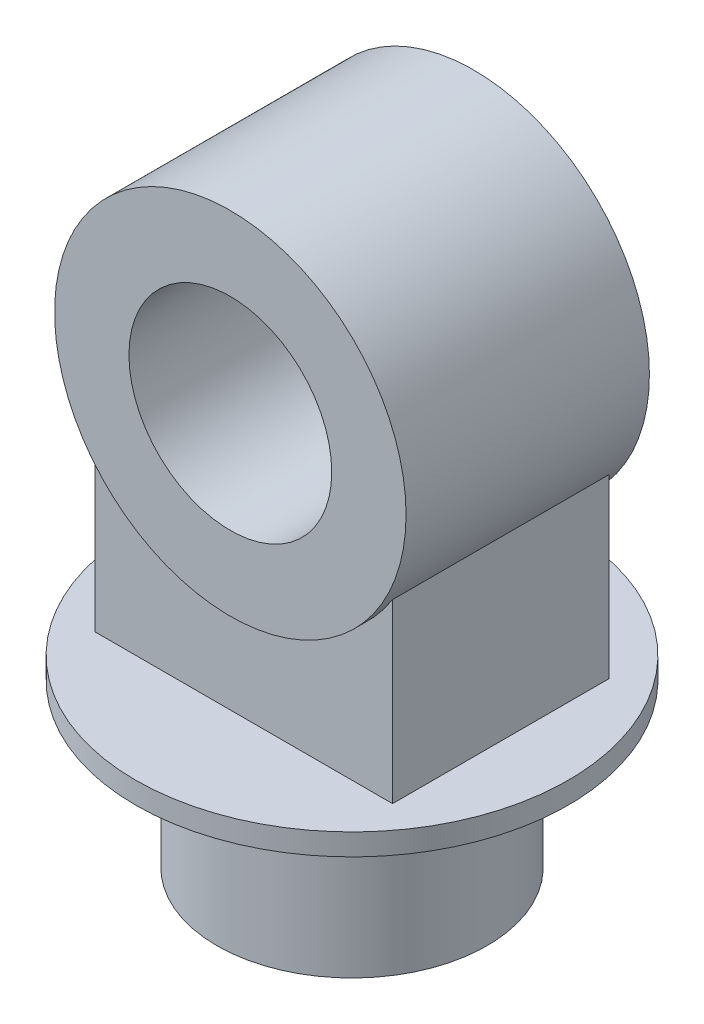
ISO-10303-21;
HEADER;
FILE_DESCRIPTION(('STEP AP214'),'2;1');
FILE_NAME('part.step','',(''),(''),'','','');
FILE_SCHEMA(('AUTOMOTIVE_DESIGN { 1 0 10303 214 1 1 1 1 }'));
ENDSEC;
DATA;
#1=APPLICATION_CONTEXT('core data for automotive mechanical design processes');
#2=APPLICATION_PROTOCOL_DEFINITION('international standard','automotive_design',2000,#1);
#3=PRODUCT_CONTEXT('',#1,'mechanical');
#4=PRODUCT('Part','Part','',(#3));
#5=PRODUCT_RELATED_PRODUCT_CATEGORY('part','',(#4));
#6=PRODUCT_DEFINITION_FORMATION('','',#4);
#7=PRODUCT_DEFINITION_CONTEXT('part definition',#1,'design');
#8=PRODUCT_DEFINITION('design','',#6,#7);
#9=PRODUCT_DEFINITION_SHAPE('','',#8);
#10=(LENGTH_UNIT() NAMED_UNIT(*) SI_UNIT(.MILLI.,.METRE.));
#11=(NAMED_UNIT(*) PLANE_ANGLE_UNIT() SI_UNIT($,.RADIAN.));
#12=(NAMED_UNIT(*) SI_UNIT($,.STERADIAN.) SOLID_ANGLE_UNIT());
#13=UNCERTAINTY_MEASURE_WITH_UNIT(LENGTH_MEASURE(1.E-05),#10,'distance_accuracy_value','');
#14=(GEOMETRIC_REPRESENTATION_CONTEXT(3) GLOBAL_UNCERTAINTY_ASSIGNED_CONTEXT((#13)) GLOBAL_UNIT_ASSIGNED_CONTEXT((#10,
#11,#12)) REPRESENTATION_CONTEXT('',''));
#15=CARTESIAN_POINT('',(0.,0.,0.));
#16=DIRECTION('',(0.,0.,1.));
#17=DIRECTION('',(1.,0.,0.));
#18=AXIS2_PLACEMENT_3D('',#15,#16,#17);
#19=CARTESIAN_POINT('',(0.,120.,0.));
#20=DIRECTION('',(0.,-1.,0.));
#21=DIRECTION('',(0.,0.,-1.));
#22=AXIS2_PLACEMENT_3D('',#19,#20,#21);
#23=CYLINDRICAL_SURFACE('',#22,100.);
#24=CARTESIAN_POINT('',(0.,120.,0.));
#25=DIRECTION('',(0.,1.,0.));
#26=DIRECTION('',(0.,0.,1.));
#27=AXIS2_PLACEMENT_3D('',#24,#25,#26);
#28=CIRCLE('',#27,100.);
#29=CARTESIAN_POINT('',(0.,120.,100.));
#30=VERTEX_POINT('',#29);
#31=EDGE_CURVE('E11',#30,#30,#28,.T.);
#32=ORIENTED_EDGE('',*,*,#31,.F.);
#33=EDGE_LOOP('',(#32));
#34=FACE_BOUND('',#33,.T.);
#35=CARTESIAN_POINT('',(0.,0.,0.));
#36=DIRECTION('',(0.,1.,0.));
#37=DIRECTION('',(0.,0.,1.));
#38=AXIS2_PLACEMENT_3D('',#35,#36,#37);
#39=CIRCLE('',#38,100.);
#40=CARTESIAN_POINT('',(0.,0.,100.));
#41=VERTEX_POINT('',#40);
#42=EDGE_CURVE('E42',#41,#41,#39,.T.);
#43=ORIENTED_EDGE('',*,*,#42,.T.);
#44=EDGE_LOOP('',(#43));
#45=FACE_BOUND('',#44,.T.);
#46=ADVANCED_FACE('F39',(#34,#45),#23,.T.);
#47=CARTESIAN_POINT('',(0.,0.,0.));
#48=DIRECTION('',(0.,1.,0.));
#49=DIRECTION('',(0.,0.,1.));
#50=AXIS2_PLACEMENT_3D('',#47,#48,#49);
#51=PLANE('',#50);
#52=ORIENTED_EDGE('',*,*,#42,.F.);
#53=EDGE_LOOP('',(#52));
#54=FACE_BOUND('',#53,.T.);
#55=ADVANCED_FACE('F115',(#54),#51,.F.);
#56=CARTESIAN_POINT('',(0.,136.,0.));
#57=DIRECTION('',(0.,-1.,0.));
#58=DIRECTION('',(0.,0.,-1.));
#59=AXIS2_PLACEMENT_3D('',#56,#57,#58);
#60=CYLINDRICAL_SURFACE('',#59,160.);
#61=CARTESIAN_POINT('',(0.,136.,0.));
#62=DIRECTION('',(0.,1.,0.));
#63=DIRECTION('',(0.,0.,1.));
#64=AXIS2_PLACEMENT_3D('',#61,#62,#63);
#65=CIRCLE('',#64,160.);
#66=CARTESIAN_POINT('',(0.,136.,160.));
#67=VERTEX_POINT('',#66);
#68=EDGE_CURVE('E102',#67,#67,#65,.T.);
#69=ORIENTED_EDGE('',*,*,#68,.F.);
#70=EDGE_LOOP('',(#69));
#71=FACE_BOUND('',#70,.T.);
#72=CARTESIAN_POINT('',(0.,120.,0.));
#73=DIRECTION('',(0.,1.,0.));
#74=DIRECTION('',(0.,0.,1.));
#75=AXIS2_PLACEMENT_3D('',#72,#73,#74);
#76=CIRCLE('',#75,160.);
#77=CARTESIAN_POINT('',(0.,120.,160.));
#78=VERTEX_POINT('',#77);
#79=EDGE_CURVE('E99',#78,#78,#76,.T.);
#80=ORIENTED_EDGE('',*,*,#79,.T.);
#81=EDGE_LOOP('',(#80));
#82=FACE_BOUND('',#81,.T.);
#83=ADVANCED_FACE('F117',(#71,#82),#60,.T.);
#84=CARTESIAN_POINT('',(0.,136.,0.));
#85=DIRECTION('',(0.,1.,0.));
#86=DIRECTION('',(0.,0.,1.));
#87=AXIS2_PLACEMENT_3D('',#84,#85,#86);
#88=PLANE('',#87);
#89=DIRECTION('',(0.,0.,1.));
#90=VECTOR('',#89,1.);
#91=CARTESIAN_POINT('',(-110.,136.,80.));
#92=LINE('',#91,#90);
#93=CARTESIAN_POINT('',(-110.,136.,-80.));
#94=VERTEX_POINT('',#93);
#95=CARTESIAN_POINT('',(-110.,136.,80.));
#96=VERTEX_POINT('',#95);
#97=EDGE_CURVE('E53',#94,#96,#92,.T.);
#98=ORIENTED_EDGE('',*,*,#97,.F.);
#99=DIRECTION('',(-1.,0.,0.));
#100=VECTOR('',#99,1.);
#101=CARTESIAN_POINT('',(110.,136.,-80.));
#102=LINE('',#101,#100);
#103=CARTESIAN_POINT('',(110.,136.,-80.));
#104=VERTEX_POINT('',#103);
#105=EDGE_CURVE('E58',#104,#94,#102,.T.);
#106=ORIENTED_EDGE('',*,*,#105,.F.);
#107=DIRECTION('',(0.,0.,-1.));
#108=VECTOR('',#107,1.);
#109=CARTESIAN_POINT('',(110.,136.,80.));
#110=LINE('',#109,#108);
#111=CARTESIAN_POINT('',(110.,136.,80.));
#112=VERTEX_POINT('',#111);
#113=EDGE_CURVE('E179',#112,#104,#110,.T.);
#114=ORIENTED_EDGE('',*,*,#113,.F.);
#115=DIRECTION('',(1.,0.,0.));
#116=VECTOR('',#115,1.);
#117=CARTESIAN_POINT('',(110.,136.,80.));
#118=LINE('',#117,#116);
#119=EDGE_CURVE('E84',#96,#112,#118,.T.);
#120=ORIENTED_EDGE('',*,*,#119,.F.);
#121=EDGE_LOOP('',(#98,#106,#114,#120));
#122=FACE_BOUND('',#121,.T.);
#123=ORIENTED_EDGE('',*,*,#68,.T.);
#124=EDGE_LOOP('',(#123));
#125=FACE_BOUND('',#124,.T.);
#126=ADVANCED_FACE('F122',(#122,#125),#88,.T.);
#127=CARTESIAN_POINT('',(0.,120.,0.));
#128=DIRECTION('',(0.,1.,0.));
#129=DIRECTION('',(0.,0.,1.));
#130=AXIS2_PLACEMENT_3D('',#127,#128,#129);
#131=PLANE('',#130);
#132=ORIENTED_EDGE('',*,*,#31,.T.);
#133=EDGE_LOOP('',(#132));
#134=FACE_BOUND('',#133,.T.);
#135=ORIENTED_EDGE('',*,*,#79,.F.);
#136=EDGE_LOOP('',(#135));
#137=FACE_BOUND('',#136,.T.);
#138=ADVANCED_FACE('F127',(#134,#137),#131,.F.);
#139=CARTESIAN_POINT('',(110.,466.002,80.));
#140=DIRECTION('',(0.,0.,-1.));
#141=DIRECTION('',(-1.,0.,0.));
#142=AXIS2_PLACEMENT_3D('',#139,#140,#141);
#143=PLANE('',#142);
#144=CARTESIAN_POINT('',(0.,336.,80.));
#145=DIRECTION('',(0.,0.,-1.));
#146=DIRECTION('',(-1.,0.,0.));
#147=AXIS2_PLACEMENT_3D('',#144,#145,#146);
#148=CIRCLE('',#147,130.);
#149=CARTESIAN_POINT('',(-110.,266.717967697245,80.));
#150=VERTEX_POINT('',#149);
#151=CARTESIAN_POINT('',(110.,266.717967697245,80.));
#152=VERTEX_POINT('',#151);
#153=EDGE_CURVE('E94',#150,#152,#148,.F.);
#154=ORIENTED_EDGE('',*,*,#153,.F.);
#155=DIRECTION('',(0.,-1.,0.));
#156=VECTOR('',#155,1.);
#157=CARTESIAN_POINT('',(-110.,466.002,80.));
#158=LINE('',#157,#156);
#159=EDGE_CURVE('E91',#150,#96,#158,.T.);
#160=ORIENTED_EDGE('',*,*,#159,.T.);
#161=ORIENTED_EDGE('',*,*,#119,.T.);
#162=DIRECTION('',(0.,-1.,0.));
#163=VECTOR('',#162,1.);
#164=CARTESIAN_POINT('',(110.,466.002,80.));
#165=LINE('',#164,#163);
#166=EDGE_CURVE('E186',#152,#112,#165,.T.);
#167=ORIENTED_EDGE('',*,*,#166,.F.);
#168=EDGE_LOOP('',(#154,#160,#161,#167));
#169=FACE_BOUND('',#168,.T.);
#170=ADVANCED_FACE('F130',(#169),#143,.F.);
#171=CARTESIAN_POINT('',(-110.,466.002,80.));
#172=DIRECTION('',(1.,0.,0.));
#173=DIRECTION('',(0.,0.,-1.));
#174=AXIS2_PLACEMENT_3D('',#171,#172,#173);
#175=PLANE('',#174);
#176=DIRECTION('',(0.,0.,-1.));
#177=VECTOR('',#176,1.);
#178=CARTESIAN_POINT('',(-110.,266.717967697245,90.));
#179=LINE('',#178,#177);
#180=CARTESIAN_POINT('',(-110.,266.717967697245,-80.));
#181=VERTEX_POINT('',#180);
#182=EDGE_CURVE('E88',#181,#150,#179,.F.);
#183=ORIENTED_EDGE('',*,*,#182,.F.);
#184=DIRECTION('',(0.,-1.,0.));
#185=VECTOR('',#184,1.);
#186=CARTESIAN_POINT('',(-110.,466.002,-80.));
#187=LINE('',#186,#185);
#188=EDGE_CURVE('E76',#181,#94,#187,.T.);
#189=ORIENTED_EDGE('',*,*,#188,.T.);
#190=ORIENTED_EDGE('',*,*,#97,.T.);
#191=ORIENTED_EDGE('',*,*,#159,.F.);
#192=EDGE_LOOP('',(#183,#189,#190,#191));
#193=FACE_BOUND('',#192,.T.);
#194=ADVANCED_FACE('F89',(#193),#175,.F.);
#195=CARTESIAN_POINT('',(110.,466.002,80.));
#196=DIRECTION('',(-1.,0.,0.));
#197=DIRECTION('',(0.,0.,1.));
#198=AXIS2_PLACEMENT_3D('',#195,#196,#197);
#199=PLANE('',#198);
#200=DIRECTION('',(0.,0.,-1.));
#201=VECTOR('',#200,1.);
#202=CARTESIAN_POINT('',(110.,266.717967697245,90.));
#203=LINE('',#202,#201);
#204=CARTESIAN_POINT('',(110.,266.717967697245,-80.));
#205=VERTEX_POINT('',#204);
#206=EDGE_CURVE('E98',#152,#205,#203,.T.);
#207=ORIENTED_EDGE('',*,*,#206,.F.);
#208=ORIENTED_EDGE('',*,*,#166,.T.);
#209=ORIENTED_EDGE('',*,*,#113,.T.);
#210=DIRECTION('',(0.,-1.,0.));
#211=VECTOR('',#210,1.);
#212=CARTESIAN_POINT('',(110.,466.002,-80.));
#213=LINE('',#212,#211);
#214=EDGE_CURVE('E83',#205,#104,#213,.T.);
#215=ORIENTED_EDGE('',*,*,#214,.F.);
#216=EDGE_LOOP('',(#207,#208,#209,#215));
#217=FACE_BOUND('',#216,.T.);
#218=ADVANCED_FACE('F136',(#217),#199,.F.);
#219=CARTESIAN_POINT('',(110.,466.002,-80.));
#220=DIRECTION('',(0.,0.,1.));
#221=DIRECTION('',(1.,0.,0.));
#222=AXIS2_PLACEMENT_3D('',#219,#220,#221);
#223=PLANE('',#222);
#224=CARTESIAN_POINT('',(0.,336.,-80.));
#225=DIRECTION('',(0.,0.,1.));
#226=DIRECTION('',(1.,0.,0.));
#227=AXIS2_PLACEMENT_3D('',#224,#225,#226);
#228=CIRCLE('',#227,130.);
#229=EDGE_CURVE('E80',#205,#181,#228,.F.);
#230=ORIENTED_EDGE('',*,*,#229,.F.);
#231=ORIENTED_EDGE('',*,*,#214,.T.);
#232=ORIENTED_EDGE('',*,*,#105,.T.);
#233=ORIENTED_EDGE('',*,*,#188,.F.);
#234=EDGE_LOOP('',(#230,#231,#232,#233));
#235=FACE_BOUND('',#234,.T.);
#236=ADVANCED_FACE('F78',(#235),#223,.F.);
#237=CARTESIAN_POINT('',(0.,336.,90.));
#238=DIRECTION('',(0.,0.,-1.));
#239=DIRECTION('',(-1.,0.,0.));
#240=AXIS2_PLACEMENT_3D('',#237,#238,#239);
#241=CYLINDRICAL_SURFACE('',#240,130.);
#242=CARTESIAN_POINT('',(0.,336.,90.));
#243=DIRECTION('',(0.,0.,1.));
#244=DIRECTION('',(1.,0.,0.));
#245=AXIS2_PLACEMENT_3D('',#242,#243,#244);
#246=CIRCLE('',#245,130.);
#247=CARTESIAN_POINT('',(130.,336.,90.));
#248=VERTEX_POINT('',#247);
#249=EDGE_CURVE('E173',#248,#248,#246,.T.);
#250=ORIENTED_EDGE('',*,*,#249,.F.);
#251=EDGE_LOOP('',(#250));
#252=FACE_BOUND('',#251,.T.);
#253=CARTESIAN_POINT('',(0.,336.,-90.));
#254=DIRECTION('',(0.,0.,1.));
#255=DIRECTION('',(1.,0.,0.));
#256=AXIS2_PLACEMENT_3D('',#253,#254,#255);
#257=CIRCLE('',#256,130.);
#258=CARTESIAN_POINT('',(130.,336.,-90.));
#259=VERTEX_POINT('',#258);
#260=EDGE_CURVE('E170',#259,#259,#257,.T.);
#261=ORIENTED_EDGE('',*,*,#260,.T.);
#262=EDGE_LOOP('',(#261));
#263=FACE_BOUND('',#262,.T.);
#264=ORIENTED_EDGE('',*,*,#182,.T.);
#265=ORIENTED_EDGE('',*,*,#153,.T.);
#266=ORIENTED_EDGE('',*,*,#206,.T.);
#267=ORIENTED_EDGE('',*,*,#229,.T.);
#268=EDGE_LOOP('',(#264,#265,#266,#267));
#269=FACE_BOUND('',#268,.T.);
#270=ADVANCED_FACE('F97',(#252,#263,#269),#241,.T.);
#271=CARTESIAN_POINT('',(0.,336.,90.));
#272=DIRECTION('',(0.,0.,1.));
#273=DIRECTION('',(1.,0.,0.));
#274=AXIS2_PLACEMENT_3D('',#271,#272,#273);
#275=PLANE('',#274);
#276=ORIENTED_EDGE('',*,*,#249,.T.);
#277=EDGE_LOOP('',(#276));
#278=FACE_BOUND('',#277,.T.);
#279=CARTESIAN_POINT('',(0.,336.,90.));
#280=DIRECTION('',(0.,0.,1.));
#281=DIRECTION('',(1.,0.,0.));
#282=AXIS2_PLACEMENT_3D('',#279,#280,#281);
#283=CIRCLE('',#282,75.);
#284=CARTESIAN_POINT('',(-75.,336.,90.));
#285=VERTEX_POINT('',#284);
#286=EDGE_CURVE('E164',#285,#285,#283,.T.);
#287=ORIENTED_EDGE('',*,*,#286,.F.);
#288=EDGE_LOOP('',(#287));
#289=FACE_BOUND('',#288,.T.);
#290=ADVANCED_FACE('F147',(#278,#289),#275,.T.);
#291=CARTESIAN_POINT('',(0.,336.,-90.));
#292=DIRECTION('',(0.,0.,1.));
#293=DIRECTION('',(1.,0.,0.));
#294=AXIS2_PLACEMENT_3D('',#291,#292,#293);
#295=PLANE('',#294);
#296=ORIENTED_EDGE('',*,*,#260,.F.);
#297=EDGE_LOOP('',(#296));
#298=FACE_BOUND('',#297,.T.);
#299=CARTESIAN_POINT('',(0.,336.,-90.));
#300=DIRECTION('',(0.,0.,1.));
#301=DIRECTION('',(1.,0.,0.));
#302=AXIS2_PLACEMENT_3D('',#299,#300,#301);
#303=CIRCLE('',#302,75.);
#304=CARTESIAN_POINT('',(-75.,336.,-90.));
#305=VERTEX_POINT('',#304);
#306=EDGE_CURVE('E167',#305,#305,#303,.T.);
#307=ORIENTED_EDGE('',*,*,#306,.T.);
#308=EDGE_LOOP('',(#307));
#309=FACE_BOUND('',#308,.T.);
#310=ADVANCED_FACE('F149',(#298,#309),#295,.F.);
#311=CARTESIAN_POINT('',(0.,336.,90.));
#312=DIRECTION('',(0.,0.,-1.));
#313=DIRECTION('',(-1.,0.,0.));
#314=AXIS2_PLACEMENT_3D('',#311,#312,#313);
#315=CYLINDRICAL_SURFACE('',#314,75.);
#316=CARTESIAN_POINT('',(-75.,336.,90.));
#317=CARTESIAN_POINT('',(-75.,336.,88.125));
#318=CARTESIAN_POINT('',(-75.,336.,86.25));
#319=CARTESIAN_POINT('',(-75.,336.,82.5));
#320=CARTESIAN_POINT('',(-75.,336.,80.625));
#321=CARTESIAN_POINT('',(-75.,336.,76.875));
#322=CARTESIAN_POINT('',(-75.,336.,75.));
#323=CARTESIAN_POINT('',(-75.,336.,71.25));
#324=CARTESIAN_POINT('',(-75.,336.,69.375));
#325=CARTESIAN_POINT('',(-75.,336.,65.625));
#326=CARTESIAN_POINT('',(-75.,336.,63.75));
#327=CARTESIAN_POINT('',(-75.,336.,60.));
#328=CARTESIAN_POINT('',(-75.,336.,58.125));
#329=CARTESIAN_POINT('',(-75.,336.,54.375));
#330=CARTESIAN_POINT('',(-75.,336.,52.5));
#331=CARTESIAN_POINT('',(-75.,336.,48.75));
#332=CARTESIAN_POINT('',(-75.,336.,46.875));
#333=CARTESIAN_POINT('',(-75.,336.,43.125));
#334=CARTESIAN_POINT('',(-75.,336.,41.25));
#335=CARTESIAN_POINT('',(-75.,336.,37.5));
#336=CARTESIAN_POINT('',(-75.,336.,35.625));
#337=CARTESIAN_POINT('',(-75.,336.,31.875));
#338=CARTESIAN_POINT('',(-75.,336.,30.));
#339=CARTESIAN_POINT('',(-75.,336.,26.25));
#340=CARTESIAN_POINT('',(-75.,336.,24.375));
#341=CARTESIAN_POINT('',(-75.,336.,20.625));
#342=CARTESIAN_POINT('',(-75.,336.,18.75));
#343=CARTESIAN_POINT('',(-75.,336.,15.));
#344=CARTESIAN_POINT('',(-75.,336.,13.125));
#345=CARTESIAN_POINT('',(-75.,336.,9.37499999999998));
#346=CARTESIAN_POINT('',(-75.,336.,7.49999999999998));
#347=CARTESIAN_POINT('',(-75.,336.,3.74999999999998));
#348=CARTESIAN_POINT('',(-75.,336.,1.87499999999997));
#349=CARTESIAN_POINT('',(-75.,336.,-1.87500000000003));
#350=CARTESIAN_POINT('',(-75.,336.,-3.75000000000003));
#351=CARTESIAN_POINT('',(-75.,336.,-7.50000000000003));
#352=CARTESIAN_POINT('',(-75.,336.,-9.37500000000004));
#353=CARTESIAN_POINT('',(-75.,336.,-13.125));
#354=CARTESIAN_POINT('',(-75.,336.,-15.));
#355=CARTESIAN_POINT('',(-75.,336.,-18.75));
#356=CARTESIAN_POINT('',(-75.,336.,-20.625));
#357=CARTESIAN_POINT('',(-75.,336.,-24.375));
#358=CARTESIAN_POINT('',(-75.,336.,-26.25));
#359=CARTESIAN_POINT('',(-75.,336.,-30.));
#360=CARTESIAN_POINT('',(-75.,336.,-31.875));
#361=CARTESIAN_POINT('',(-75.,336.,-35.625));
#362=CARTESIAN_POINT('',(-75.,336.,-37.5));
#363=CARTESIAN_POINT('',(-75.,336.,-41.25));
#364=CARTESIAN_POINT('',(-75.,336.,-43.125));
#365=CARTESIAN_POINT('',(-75.,336.,-46.875));
#366=CARTESIAN_POINT('',(-75.,336.,-48.75));
#367=CARTESIAN_POINT('',(-75.,336.,-52.5));
#368=CARTESIAN_POINT('',(-75.,336.,-54.375));
#369=CARTESIAN_POINT('',(-75.,336.,-58.125));
#370=CARTESIAN_POINT('',(-75.,336.,-60.));
#371=CARTESIAN_POINT('',(-75.,336.,-63.75));
#372=CARTESIAN_POINT('',(-75.,336.,-65.625));
#373=CARTESIAN_POINT('',(-75.,336.,-69.375));
#374=CARTESIAN_POINT('',(-75.,336.,-71.25));
#375=CARTESIAN_POINT('',(-75.,336.,-75.));
#376=CARTESIAN_POINT('',(-75.,336.,-76.875));
#377=CARTESIAN_POINT('',(-75.,336.,-80.625));
#378=CARTESIAN_POINT('',(-75.,336.,-82.5));
#379=CARTESIAN_POINT('',(-75.,336.,-86.25));
#380=CARTESIAN_POINT('',(-75.,336.,-88.125));
#381=CARTESIAN_POINT('',(-75.,336.,-90.));
#382=B_SPLINE_CURVE_WITH_KNOTS('',3,(#316,#317,#318,#319,#320,#321,#322,#323,#324,#325,#326,
#327,#328,#329,#330,#331,#332,#333,#334,#335,#336,#337,#338,#339,#340,#341,#342,#343,#344,#345,
#346,#347,#348,#349,#350,#351,#352,#353,#354,#355,#356,#357,#358,#359,#360,#361,#362,#363,#364,
#365,#366,#367,#368,#369,#370,#371,#372,#373,#374,#375,#376,#377,#378,#379,#380,#381),
.UNSPECIFIED.,.F.,.F.,(4,2,2,2,2,2,2,2,2,2,2,2,2,2,2,2,2,2,2,2,2,2,2,2,2,2,2,2,2,2,2,2,4),(0.,
5.62499999999999,11.25,16.875,22.5,28.125,33.75,39.375,45.,50.625,56.25,61.875,67.5,73.125,
78.75,84.375,90.,95.625,101.25,106.875,112.5,118.125,123.75,129.375,135.,140.625,146.25,151.875,
157.5,163.125,168.75,174.375,180.),.UNSPECIFIED.);
#383=EDGE_CURVE('BSEAM152',#285,#305,#382,.T.);
#384=ORIENTED_EDGE('',*,*,#286,.T.);
#385=ORIENTED_EDGE('',*,*,#306,.F.);
#386=ORIENTED_EDGE('',*,*,#383,.T.);
#387=ORIENTED_EDGE('',*,*,#383,.F.);
#388=EDGE_LOOP('',(#384,#386,#385,#387));
#389=FACE_BOUND('',#388,.T.);
#390=ADVANCED_FACE('F152',(#389),#315,.F.);
#391=CLOSED_SHELL('',(#46,#55,#83,#126,#138,#170,#194,#218,#236,#270,#290,#310,#390));
#392=MANIFOLD_SOLID_BREP('B2',#391);
#393=ADVANCED_BREP_SHAPE_REPRESENTATION('',(#18,#392),#14);
#394=SHAPE_DEFINITION_REPRESENTATION(#9,#393);
ENDSEC;
END-ISO-10303-21;
